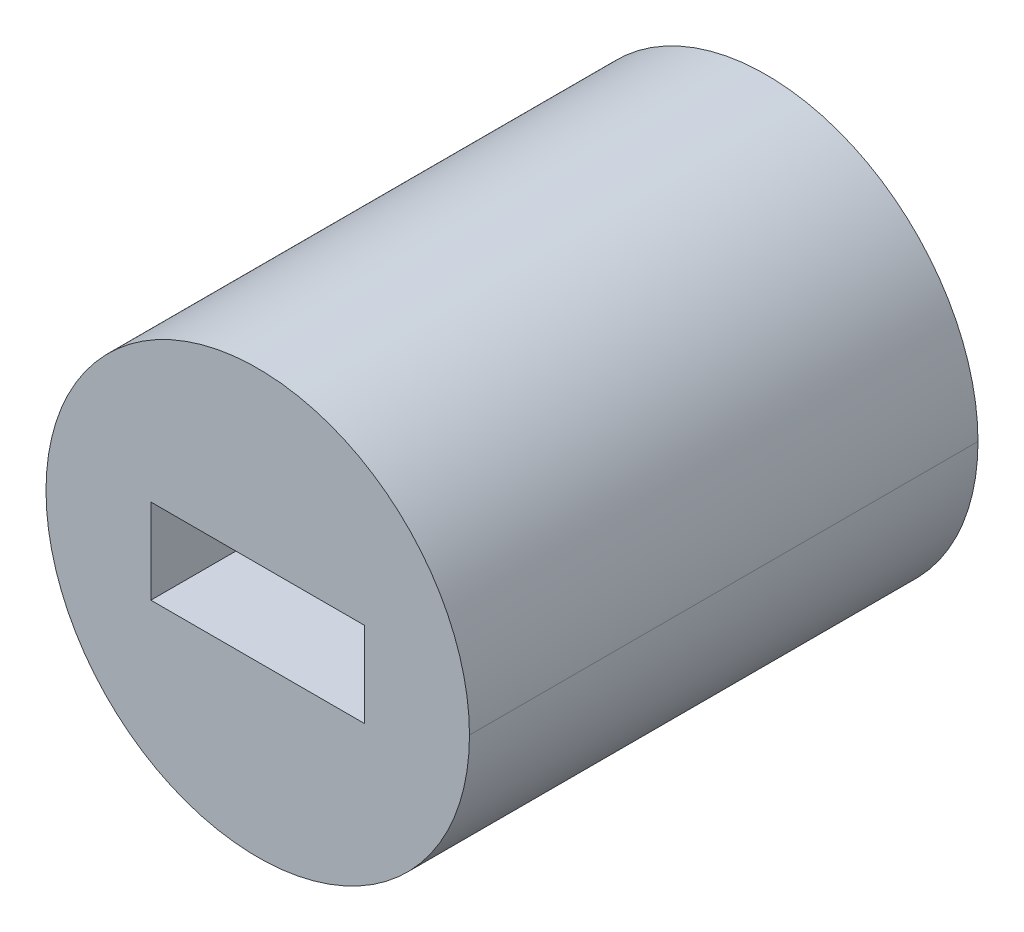
ISO-10303-21;
HEADER;
FILE_DESCRIPTION(('STEP AP214'),'2;1');
FILE_NAME('part.step','',(''),(''),'','','');
FILE_SCHEMA(('AUTOMOTIVE_DESIGN { 1 0 10303 214 1 1 1 1 }'));
ENDSEC;
DATA;
#1=APPLICATION_CONTEXT('core data for automotive mechanical design processes');
#2=APPLICATION_PROTOCOL_DEFINITION('international standard','automotive_design',2000,#1);
#3=PRODUCT_CONTEXT('',#1,'mechanical');
#4=PRODUCT('Part','Part','',(#3));
#5=PRODUCT_RELATED_PRODUCT_CATEGORY('part','',(#4));
#6=PRODUCT_DEFINITION_FORMATION('','',#4);
#7=PRODUCT_DEFINITION_CONTEXT('part definition',#1,'design');
#8=PRODUCT_DEFINITION('design','',#6,#7);
#9=PRODUCT_DEFINITION_SHAPE('','',#8);
#10=(LENGTH_UNIT() NAMED_UNIT(*) SI_UNIT(.MILLI.,.METRE.));
#11=(NAMED_UNIT(*) PLANE_ANGLE_UNIT() SI_UNIT($,.RADIAN.));
#12=(NAMED_UNIT(*) SI_UNIT($,.STERADIAN.) SOLID_ANGLE_UNIT());
#13=UNCERTAINTY_MEASURE_WITH_UNIT(LENGTH_MEASURE(1.E-05),#10,'distance_accuracy_value','');
#14=(GEOMETRIC_REPRESENTATION_CONTEXT(3) GLOBAL_UNCERTAINTY_ASSIGNED_CONTEXT((#13)) GLOBAL_UNIT_ASSIGNED_CONTEXT((#10,
#11,#12)) REPRESENTATION_CONTEXT('',''));
#15=CARTESIAN_POINT('',(0.,0.,0.));
#16=DIRECTION('',(0.,0.,1.));
#17=DIRECTION('',(1.,0.,0.));
#18=AXIS2_PLACEMENT_3D('',#15,#16,#17);
#19=CARTESIAN_POINT('',(-0.641005819512,0.,3.05));
#20=DIRECTION('',(1.,0.,0.));
#21=DIRECTION('',(0.,1.,0.));
#22=AXIS2_PLACEMENT_3D('',#19,#20,#21);
#23=PLANE('',#22);
#24=DIRECTION('',(0.,-1.,0.));
#25=VECTOR('',#24,1.);
#26=CARTESIAN_POINT('',(-0.641005819512,0.,1.55));
#27=LINE('',#26,#25);
#28=CARTESIAN_POINT('',(-0.641005819512,0.255,1.55));
#29=VERTEX_POINT('',#28);
#30=CARTESIAN_POINT('',(-0.641005819512,-0.255,1.55));
#31=VERTEX_POINT('',#30);
#32=EDGE_CURVE('E11',#29,#31,#27,.T.);
#33=ORIENTED_EDGE('',*,*,#32,.F.);
#34=DIRECTION('',(0.,0.,-1.));
#35=VECTOR('',#34,1.);
#36=CARTESIAN_POINT('',(-0.641005819512,0.255,3.05));
#37=LINE('',#36,#35);
#38=CARTESIAN_POINT('',(-0.641005819512,0.255,3.05));
#39=VERTEX_POINT('',#38);
#40=EDGE_CURVE('E171',#39,#29,#37,.T.);
#41=ORIENTED_EDGE('',*,*,#40,.F.);
#42=DIRECTION('',(0.,-1.,0.));
#43=VECTOR('',#42,1.);
#44=CARTESIAN_POINT('',(-0.641005819512,0.,3.05));
#45=LINE('',#44,#43);
#46=CARTESIAN_POINT('',(-0.641005819512,-0.255,3.05));
#47=VERTEX_POINT('',#46);
#48=EDGE_CURVE('E203',#39,#47,#45,.T.);
#49=ORIENTED_EDGE('',*,*,#48,.T.);
#50=DIRECTION('',(0.,0.,1.));
#51=VECTOR('',#50,1.);
#52=CARTESIAN_POINT('',(-0.641005819512,-0.255,3.05));
#53=LINE('',#52,#51);
#54=EDGE_CURVE('E126',#31,#47,#53,.T.);
#55=ORIENTED_EDGE('',*,*,#54,.F.);
#56=EDGE_LOOP('',(#33,#41,#49,#55));
#57=FACE_BOUND('',#56,.T.);
#58=ADVANCED_FACE('F17',(#57),#23,.T.);
#59=CARTESIAN_POINT('',(0.,0.,1.55));
#60=DIRECTION('',(0.,0.,1.));
#61=DIRECTION('',(1.,0.,0.));
#62=AXIS2_PLACEMENT_3D('',#59,#60,#61);
#63=PLANE('',#62);
#64=DIRECTION('',(-1.,0.,0.));
#65=VECTOR('',#64,1.);
#66=CARTESIAN_POINT('',(0.528723609905,-0.255,1.55));
#67=LINE('',#66,#65);
#68=CARTESIAN_POINT('',(-0.416441400297,-0.255,1.55));
#69=VERTEX_POINT('',#68);
#70=EDGE_CURVE('E180',#69,#31,#67,.T.);
#71=ORIENTED_EDGE('',*,*,#70,.F.);
#72=DIRECTION('',(0.,1.,0.));
#73=VECTOR('',#72,1.);
#74=CARTESIAN_POINT('',(-0.416441400297,0.,1.55));
#75=LINE('',#74,#73);
#76=CARTESIAN_POINT('',(-0.416441400297,0.255,1.55));
#77=VERTEX_POINT('',#76);
#78=EDGE_CURVE('E28',#69,#77,#75,.T.);
#79=ORIENTED_EDGE('',*,*,#78,.T.);
#80=DIRECTION('',(1.,0.,0.));
#81=VECTOR('',#80,1.);
#82=CARTESIAN_POINT('',(-0.528723609905,0.255,1.55));
#83=LINE('',#82,#81);
#84=EDGE_CURVE('E174',#29,#77,#83,.T.);
#85=ORIENTED_EDGE('',*,*,#84,.F.);
#86=ORIENTED_EDGE('',*,*,#32,.T.);
#87=EDGE_LOOP('',(#71,#79,#85,#86));
#88=FACE_BOUND('',#87,.T.);
#89=ADVANCED_FACE('F416',(#88),#63,.T.);
#90=CARTESIAN_POINT('',(-0.416441400297,0.,3.05));
#91=DIRECTION('',(-1.,0.,0.));
#92=DIRECTION('',(0.,0.,1.));
#93=AXIS2_PLACEMENT_3D('',#90,#91,#92);
#94=PLANE('',#93);
#95=DIRECTION('',(0.,0.,-1.));
#96=VECTOR('',#95,1.);
#97=CARTESIAN_POINT('',(-0.416441400297,0.255,3.05));
#98=LINE('',#97,#96);
#99=CARTESIAN_POINT('',(-0.416441400297,0.255,0.));
#100=VERTEX_POINT('',#99);
#101=EDGE_CURVE('E148',#77,#100,#98,.T.);
#102=ORIENTED_EDGE('',*,*,#101,.F.);
#103=ORIENTED_EDGE('',*,*,#78,.F.);
#104=DIRECTION('',(0.,0.,1.));
#105=VECTOR('',#104,1.);
#106=CARTESIAN_POINT('',(-0.416441400297,-0.255,3.05));
#107=LINE('',#106,#105);
#108=CARTESIAN_POINT('',(-0.416441400297,-0.255,0.));
#109=VERTEX_POINT('',#108);
#110=EDGE_CURVE('E184',#109,#69,#107,.T.);
#111=ORIENTED_EDGE('',*,*,#110,.F.);
#112=DIRECTION('',(0.,-1.,0.));
#113=VECTOR('',#112,1.);
#114=CARTESIAN_POINT('',(-0.416441400297,0.,0.));
#115=LINE('',#114,#113);
#116=EDGE_CURVE('E153',#100,#109,#115,.T.);
#117=ORIENTED_EDGE('',*,*,#116,.F.);
#118=EDGE_LOOP('',(#102,#103,#111,#117));
#119=FACE_BOUND('',#118,.T.);
#120=ADVANCED_FACE('F407',(#119),#94,.F.);
#121=CARTESIAN_POINT('',(0.416441400297,0.,3.05));
#122=DIRECTION('',(1.,0.,0.));
#123=DIRECTION('',(0.,-1.,0.));
#124=AXIS2_PLACEMENT_3D('',#121,#122,#123);
#125=PLANE('',#124);
#126=DIRECTION('',(0.,0.,-1.));
#127=VECTOR('',#126,1.);
#128=CARTESIAN_POINT('',(0.416441400297,-0.255,3.05));
#129=LINE('',#128,#127);
#130=CARTESIAN_POINT('',(0.416441400297,-0.255,1.55));
#131=VERTEX_POINT('',#130);
#132=CARTESIAN_POINT('',(0.416441400297,-0.255,0.));
#133=VERTEX_POINT('',#132);
#134=EDGE_CURVE('E134',#131,#133,#129,.T.);
#135=ORIENTED_EDGE('',*,*,#134,.F.);
#136=DIRECTION('',(0.,-1.,0.));
#137=VECTOR('',#136,1.);
#138=CARTESIAN_POINT('',(0.416441400297,0.,1.55));
#139=LINE('',#138,#137);
#140=CARTESIAN_POINT('',(0.416441400297,0.255,1.55));
#141=VERTEX_POINT('',#140);
#142=EDGE_CURVE('E125',#141,#131,#139,.T.);
#143=ORIENTED_EDGE('',*,*,#142,.F.);
#144=DIRECTION('',(0.,0.,1.));
#145=VECTOR('',#144,1.);
#146=CARTESIAN_POINT('',(0.416441400297,0.255,3.05));
#147=LINE('',#146,#145);
#148=CARTESIAN_POINT('',(0.416441400297,0.255,0.));
#149=VERTEX_POINT('',#148);
#150=EDGE_CURVE('E141',#149,#141,#147,.T.);
#151=ORIENTED_EDGE('',*,*,#150,.F.);
#152=DIRECTION('',(0.,1.,0.));
#153=VECTOR('',#152,1.);
#154=CARTESIAN_POINT('',(0.416441400297,0.,0.));
#155=LINE('',#154,#153);
#156=EDGE_CURVE('E165',#133,#149,#155,.T.);
#157=ORIENTED_EDGE('',*,*,#156,.F.);
#158=EDGE_LOOP('',(#135,#143,#151,#157));
#159=FACE_BOUND('',#158,.T.);
#160=ADVANCED_FACE('F398',(#159),#125,.F.);
#161=CARTESIAN_POINT('',(0.,0.,1.55));
#162=DIRECTION('',(0.,0.,1.));
#163=DIRECTION('',(1.,0.,0.));
#164=AXIS2_PLACEMENT_3D('',#161,#162,#163);
#165=PLANE('',#164);
#166=ORIENTED_EDGE('',*,*,#142,.T.);
#167=DIRECTION('',(-1.,0.,0.));
#168=VECTOR('',#167,1.);
#169=CARTESIAN_POINT('',(0.528723609905,-0.255,1.55));
#170=LINE('',#169,#168);
#171=CARTESIAN_POINT('',(0.641005819512,-0.255,1.55));
#172=VERTEX_POINT('',#171);
#173=EDGE_CURVE('E129',#172,#131,#170,.T.);
#174=ORIENTED_EDGE('',*,*,#173,.F.);
#175=DIRECTION('',(0.,-1.,0.));
#176=VECTOR('',#175,1.);
#177=CARTESIAN_POINT('',(0.641005819512,0.,1.55));
#178=LINE('',#177,#176);
#179=CARTESIAN_POINT('',(0.641005819512,0.255,1.55));
#180=VERTEX_POINT('',#179);
#181=EDGE_CURVE('E114',#180,#172,#178,.T.);
#182=ORIENTED_EDGE('',*,*,#181,.F.);
#183=DIRECTION('',(1.,0.,0.));
#184=VECTOR('',#183,1.);
#185=CARTESIAN_POINT('',(-0.528723609905,0.255,1.55));
#186=LINE('',#185,#184);
#187=EDGE_CURVE('E158',#141,#180,#186,.T.);
#188=ORIENTED_EDGE('',*,*,#187,.F.);
#189=EDGE_LOOP('',(#166,#174,#182,#188));
#190=FACE_BOUND('',#189,.T.);
#191=ADVANCED_FACE('F130',(#190),#165,.T.);
#192=CARTESIAN_POINT('',(0.641005819512,0.,3.05));
#193=DIRECTION('',(-1.,0.,0.));
#194=DIRECTION('',(0.,0.,1.));
#195=AXIS2_PLACEMENT_3D('',#192,#193,#194);
#196=PLANE('',#195);
#197=DIRECTION('',(0.,1.,0.));
#198=VECTOR('',#197,1.);
#199=CARTESIAN_POINT('',(0.641005819512,0.,3.05));
#200=LINE('',#199,#198);
#201=CARTESIAN_POINT('',(0.641005819512,-0.255,3.05));
#202=VERTEX_POINT('',#201);
#203=CARTESIAN_POINT('',(0.641005819512,0.255,3.05));
#204=VERTEX_POINT('',#203);
#205=EDGE_CURVE('E176',#202,#204,#200,.T.);
#206=ORIENTED_EDGE('',*,*,#205,.T.);
#207=DIRECTION('',(0.,0.,1.));
#208=VECTOR('',#207,1.);
#209=CARTESIAN_POINT('',(0.641005819512,0.255,3.05));
#210=LINE('',#209,#208);
#211=EDGE_CURVE('E120',#180,#204,#210,.T.);
#212=ORIENTED_EDGE('',*,*,#211,.F.);
#213=ORIENTED_EDGE('',*,*,#181,.T.);
#214=DIRECTION('',(0.,0.,-1.));
#215=VECTOR('',#214,1.);
#216=CARTESIAN_POINT('',(0.641005819512,-0.255,3.05));
#217=LINE('',#216,#215);
#218=EDGE_CURVE('E118',#202,#172,#217,.T.);
#219=ORIENTED_EDGE('',*,*,#218,.F.);
#220=EDGE_LOOP('',(#206,#212,#213,#219));
#221=FACE_BOUND('',#220,.T.);
#222=ADVANCED_FACE('F19',(#221),#196,.T.);
#223=CARTESIAN_POINT('',(0.528723609905,-0.255,3.05));
#224=DIRECTION('',(0.,1.,0.));
#225=DIRECTION('',(1.,0.,0.));
#226=AXIS2_PLACEMENT_3D('',#223,#224,#225);
#227=PLANE('',#226);
#228=DIRECTION('',(-1.,0.,0.));
#229=VECTOR('',#228,1.);
#230=CARTESIAN_POINT('',(0.,-0.255,3.05));
#231=LINE('',#230,#229);
#232=EDGE_CURVE('E138',#202,#47,#231,.T.);
#233=ORIENTED_EDGE('',*,*,#232,.F.);
#234=ORIENTED_EDGE('',*,*,#218,.T.);
#235=ORIENTED_EDGE('',*,*,#173,.T.);
#236=ORIENTED_EDGE('',*,*,#134,.T.);
#237=DIRECTION('',(-1.,0.,0.));
#238=VECTOR('',#237,1.);
#239=CARTESIAN_POINT('',(0.,-0.255,0.));
#240=LINE('',#239,#238);
#241=EDGE_CURVE('E157',#133,#109,#240,.T.);
#242=ORIENTED_EDGE('',*,*,#241,.T.);
#243=ORIENTED_EDGE('',*,*,#110,.T.);
#244=ORIENTED_EDGE('',*,*,#70,.T.);
#245=ORIENTED_EDGE('',*,*,#54,.T.);
#246=EDGE_LOOP('',(#233,#234,#235,#236,#242,#243,#244,#245));
#247=FACE_BOUND('',#246,.T.);
#248=ADVANCED_FACE('F136',(#247),#227,.T.);
#249=CARTESIAN_POINT('',(-0.528723609905,0.255,3.05));
#250=DIRECTION('',(0.,-1.,0.));
#251=DIRECTION('',(0.,0.,-1.));
#252=AXIS2_PLACEMENT_3D('',#249,#250,#251);
#253=PLANE('',#252);
#254=ORIENTED_EDGE('',*,*,#187,.T.);
#255=ORIENTED_EDGE('',*,*,#211,.T.);
#256=DIRECTION('',(1.,0.,0.));
#257=VECTOR('',#256,1.);
#258=CARTESIAN_POINT('',(0.,0.255,3.05));
#259=LINE('',#258,#257);
#260=EDGE_CURVE('E179',#39,#204,#259,.T.);
#261=ORIENTED_EDGE('',*,*,#260,.F.);
#262=ORIENTED_EDGE('',*,*,#40,.T.);
#263=ORIENTED_EDGE('',*,*,#84,.T.);
#264=ORIENTED_EDGE('',*,*,#101,.T.);
#265=DIRECTION('',(1.,0.,0.));
#266=VECTOR('',#265,1.);
#267=CARTESIAN_POINT('',(0.,0.255,0.));
#268=LINE('',#267,#266);
#269=EDGE_CURVE('E161',#100,#149,#268,.T.);
#270=ORIENTED_EDGE('',*,*,#269,.T.);
#271=ORIENTED_EDGE('',*,*,#150,.T.);
#272=EDGE_LOOP('',(#254,#255,#261,#262,#263,#264,#270,#271));
#273=FACE_BOUND('',#272,.T.);
#274=ADVANCED_FACE('F365',(#273),#253,.T.);
#275=CARTESIAN_POINT('',(0.,0.,0.));
#276=DIRECTION('',(0.,0.,1.));
#277=DIRECTION('',(1.,0.,0.));
#278=AXIS2_PLACEMENT_3D('',#275,#276,#277);
#279=PLANE('',#278);
#280=ORIENTED_EDGE('',*,*,#116,.T.);
#281=ORIENTED_EDGE('',*,*,#241,.F.);
#282=ORIENTED_EDGE('',*,*,#156,.T.);
#283=ORIENTED_EDGE('',*,*,#269,.F.);
#284=EDGE_LOOP('',(#280,#281,#282,#283));
#285=FACE_BOUND('',#284,.T.);
#286=CARTESIAN_POINT('',(0.,0.,0.));
#287=DIRECTION('',(0.,0.,1.));
#288=DIRECTION('',(1.,0.,0.));
#289=AXIS2_PLACEMENT_3D('',#286,#287,#288);
#290=CIRCLE('',#289,1.27);
#291=CARTESIAN_POINT('',(1.27,0.,0.));
#292=VERTEX_POINT('',#291);
#293=CARTESIAN_POINT('',(-1.27,0.,0.));
#294=VERTEX_POINT('',#293);
#295=EDGE_CURVE('E21',#292,#294,#290,.T.);
#296=ORIENTED_EDGE('',*,*,#295,.F.);
#297=CARTESIAN_POINT('',(0.,0.,0.));
#298=DIRECTION('',(0.,0.,1.));
#299=DIRECTION('',(1.,0.,0.));
#300=AXIS2_PLACEMENT_3D('',#297,#298,#299);
#301=CIRCLE('',#300,1.27);
#302=EDGE_CURVE('E166',#294,#292,#301,.T.);
#303=ORIENTED_EDGE('',*,*,#302,.F.);
#304=EDGE_LOOP('',(#296,#303));
#305=FACE_BOUND('',#304,.T.);
#306=ADVANCED_FACE('F246',(#285,#305),#279,.F.);
#307=CARTESIAN_POINT('',(0.,0.,3.05));
#308=DIRECTION('',(0.,0.,1.));
#309=DIRECTION('',(1.,0.,0.));
#310=AXIS2_PLACEMENT_3D('',#307,#308,#309);
#311=PLANE('',#310);
#312=ORIENTED_EDGE('',*,*,#48,.F.);
#313=ORIENTED_EDGE('',*,*,#260,.T.);
#314=ORIENTED_EDGE('',*,*,#205,.F.);
#315=ORIENTED_EDGE('',*,*,#232,.T.);
#316=EDGE_LOOP('',(#312,#313,#314,#315));
#317=FACE_BOUND('',#316,.T.);
#318=CARTESIAN_POINT('',(0.,0.,3.05));
#319=DIRECTION('',(0.,0.,-1.));
#320=DIRECTION('',(1.,0.,0.));
#321=AXIS2_PLACEMENT_3D('',#318,#319,#320);
#322=CIRCLE('',#321,1.27);
#323=CARTESIAN_POINT('',(1.27,0.,3.05));
#324=VERTEX_POINT('',#323);
#325=CARTESIAN_POINT('',(-1.27,0.,3.05));
#326=VERTEX_POINT('',#325);
#327=EDGE_CURVE('E169',#324,#326,#322,.T.);
#328=ORIENTED_EDGE('',*,*,#327,.F.);
#329=CARTESIAN_POINT('',(0.,0.,3.05));
#330=DIRECTION('',(0.,0.,-1.));
#331=DIRECTION('',(1.,0.,0.));
#332=AXIS2_PLACEMENT_3D('',#329,#330,#331);
#333=CIRCLE('',#332,1.27);
#334=EDGE_CURVE('E191',#326,#324,#333,.T.);
#335=ORIENTED_EDGE('',*,*,#334,.F.);
#336=EDGE_LOOP('',(#328,#335));
#337=FACE_BOUND('',#336,.T.);
#338=ADVANCED_FACE('F242',(#317,#337),#311,.T.);
#339=CARTESIAN_POINT('',(0.,0.,0.));
#340=DIRECTION('',(0.,0.,1.));
#341=DIRECTION('',(1.,0.,0.));
#342=AXIS2_PLACEMENT_3D('',#339,#340,#341);
#343=CYLINDRICAL_SURFACE('',#342,1.27);
#344=DIRECTION('',(0.,0.,1.));
#345=VECTOR('',#344,1.);
#346=CARTESIAN_POINT('',(-1.27,0.,0.));
#347=LINE('',#346,#345);
#348=EDGE_CURVE('E220',#294,#326,#347,.T.);
#349=ORIENTED_EDGE('',*,*,#348,.F.);
#350=ORIENTED_EDGE('',*,*,#302,.T.);
#351=DIRECTION('',(0.,0.,1.));
#352=VECTOR('',#351,1.);
#353=CARTESIAN_POINT('',(1.27,0.,0.));
#354=LINE('',#353,#352);
#355=EDGE_CURVE('E170',#292,#324,#354,.T.);
#356=ORIENTED_EDGE('',*,*,#355,.T.);
#357=ORIENTED_EDGE('',*,*,#327,.T.);
#358=EDGE_LOOP('',(#349,#350,#356,#357));
#359=FACE_BOUND('',#358,.T.);
#360=ADVANCED_FACE('F244',(#359),#343,.T.);
#361=CARTESIAN_POINT('',(0.,0.,0.));
#362=DIRECTION('',(0.,0.,1.));
#363=DIRECTION('',(1.,0.,0.));
#364=AXIS2_PLACEMENT_3D('',#361,#362,#363);
#365=CYLINDRICAL_SURFACE('',#364,1.27);
#366=ORIENTED_EDGE('',*,*,#295,.T.);
#367=ORIENTED_EDGE('',*,*,#348,.T.);
#368=ORIENTED_EDGE('',*,*,#334,.T.);
#369=ORIENTED_EDGE('',*,*,#355,.F.);
#370=EDGE_LOOP('',(#366,#367,#368,#369));
#371=FACE_BOUND('',#370,.T.);
#372=ADVANCED_FACE('F237',(#371),#365,.T.);
#373=CLOSED_SHELL('',(#58,#89,#120,#160,#191,#222,#248,#274,#306,#338,#360,#372));
#374=MANIFOLD_SOLID_BREP('B1',#373);
#375=ADVANCED_BREP_SHAPE_REPRESENTATION('',(#18,#374),#14);
#376=SHAPE_DEFINITION_REPRESENTATION(#9,#375);
ENDSEC;
END-ISO-10303-21;
